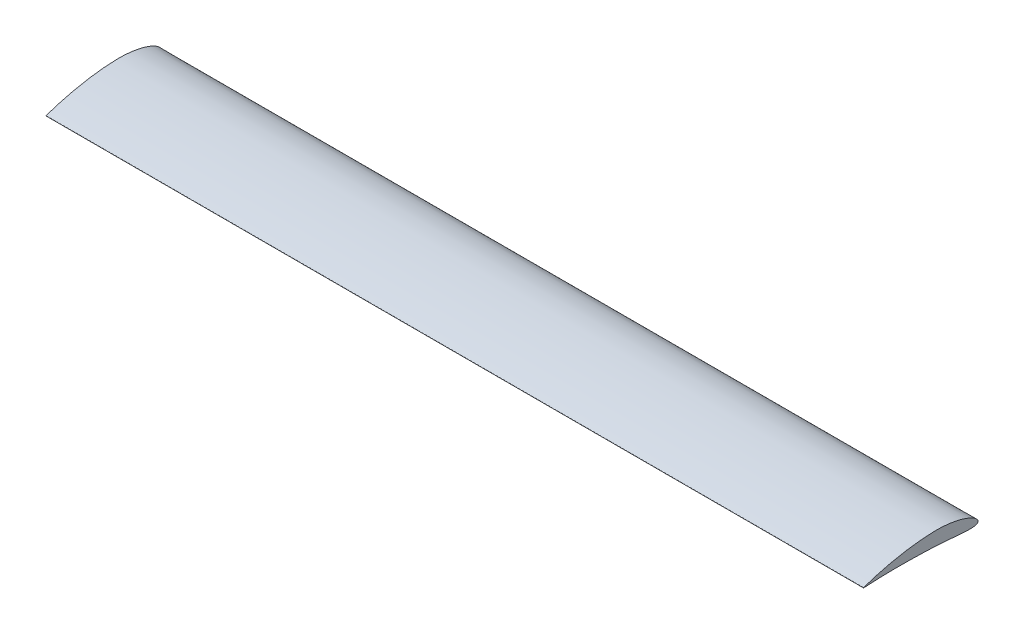
ISO-10303-21;
HEADER;
FILE_DESCRIPTION(('STEP AP214'),'2;1');
FILE_NAME('part.step','',(''),(''),'','','');
FILE_SCHEMA(('AUTOMOTIVE_DESIGN { 1 0 10303 214 1 1 1 1 }'));
ENDSEC;
DATA;
#1=APPLICATION_CONTEXT('core data for automotive mechanical design processes');
#2=APPLICATION_PROTOCOL_DEFINITION('international standard','automotive_design',2000,#1);
#3=PRODUCT_CONTEXT('',#1,'mechanical');
#4=PRODUCT('Part','Part','',(#3));
#5=PRODUCT_RELATED_PRODUCT_CATEGORY('part','',(#4));
#6=PRODUCT_DEFINITION_FORMATION('','',#4);
#7=PRODUCT_DEFINITION_CONTEXT('part definition',#1,'design');
#8=PRODUCT_DEFINITION('design','',#6,#7);
#9=PRODUCT_DEFINITION_SHAPE('','',#8);
#10=(LENGTH_UNIT() NAMED_UNIT(*) SI_UNIT(.MILLI.,.METRE.));
#11=(NAMED_UNIT(*) PLANE_ANGLE_UNIT() SI_UNIT($,.RADIAN.));
#12=(NAMED_UNIT(*) SI_UNIT($,.STERADIAN.) SOLID_ANGLE_UNIT());
#13=UNCERTAINTY_MEASURE_WITH_UNIT(LENGTH_MEASURE(1.E-05),#10,'distance_accuracy_value','');
#14=(GEOMETRIC_REPRESENTATION_CONTEXT(3) GLOBAL_UNCERTAINTY_ASSIGNED_CONTEXT((#13)) GLOBAL_UNIT_ASSIGNED_CONTEXT((#10,
#11,#12)) REPRESENTATION_CONTEXT('',''));
#15=CARTESIAN_POINT('',(0.,0.,0.));
#16=DIRECTION('',(0.,0.,1.));
#17=DIRECTION('',(1.,0.,0.));
#18=AXIS2_PLACEMENT_3D('',#15,#16,#17);
#19=CARTESIAN_POINT('',(-1270.,-0.0302571964763549,354.787327227915));
#20=CARTESIAN_POINT('',(-1270.,-0.202511549774369,354.777220058735));
#21=CARTESIAN_POINT('',(-1270.,-0.758116619532224,354.744619463571));
#22=CARTESIAN_POINT('',(-1270.,-0.0353878265544988,352.780150329408));
#23=CARTESIAN_POINT('',(-1270.,-0.406394891328532,350.227621537646));
#24=CARTESIAN_POINT('',(-1270.,0.191518705423128,345.076973542852));
#25=CARTESIAN_POINT('',(-1270.,0.426846954997304,338.388880463138));
#26=CARTESIAN_POINT('',(-1270.,0.912902226587254,329.767358245601));
#27=CARTESIAN_POINT('',(-1270.,1.37107480853054,319.513378005819));
#28=CARTESIAN_POINT('',(-1270.,1.85212662662604,307.681856469284));
#29=CARTESIAN_POINT('',(-1270.,2.2828903737653,294.437996631764));
#30=CARTESIAN_POINT('',(-1270.,2.65636592644588,279.933149694368));
#31=CARTESIAN_POINT('',(-1270.,2.90744759821903,264.337268620967));
#32=CARTESIAN_POINT('',(-1270.,3.02848065946825,247.830237404837));
#33=CARTESIAN_POINT('',(-1270.,2.97910623211237,224.541124113717));
#34=CARTESIAN_POINT('',(-1270.,2.58624656268472,200.671973719441));
#35=CARTESIAN_POINT('',(-1270.,1.91789319340299,176.483884619505));
#36=CARTESIAN_POINT('',(-1270.,1.28674404323604,158.296467958687));
#37=CARTESIAN_POINT('',(-1270.,0.674535202653767,140.48477689744));
#38=CARTESIAN_POINT('',(-1270.,-0.458414507964394,117.937239158073));
#39=CARTESIAN_POINT('',(-1270.,-2.15355585803942,96.4067365521407));
#40=CARTESIAN_POINT('',(-1270.,-3.98391169785236,75.9298626432168));
#41=CARTESIAN_POINT('',(-1270.,-5.23803481691952,61.9523939500743));
#42=CARTESIAN_POINT('',(-1270.,-6.3018667845873,49.0830780174977));
#43=CARTESIAN_POINT('',(-1270.,-7.05379709208437,37.4470572233417));
#44=CARTESIAN_POINT('',(-1270.,-7.40487495085787,27.1638266260831));
#45=CARTESIAN_POINT('',(-1270.,-7.26852765592077,18.3491197902741));
#46=CARTESIAN_POINT('',(-1270.,-6.58746462442697,11.0873159681167));
#47=CARTESIAN_POINT('',(-1270.,-5.28808573883758,5.4507808849597));
#48=CARTESIAN_POINT('',(-1270.,-3.30894318563573,1.35108725963543));
#49=CARTESIAN_POINT('',(-1270.,-0.148325215865237,-0.987487677240321));
#50=CARTESIAN_POINT('',(-1270.,3.7967578133831,-0.765838064798878));
#51=CARTESIAN_POINT('',(-1270.,7.71649979382027,1.67922407257184));
#52=CARTESIAN_POINT('',(-1270.,11.8553419578337,5.92689766090299));
#53=CARTESIAN_POINT('',(-1270.,16.2262899348965,12.1072031542234));
#54=CARTESIAN_POINT('',(-1270.,20.7343193498453,20.187014187513));
#55=CARTESIAN_POINT('',(-1270.,25.2201252971746,30.130463623116));
#56=CARTESIAN_POINT('',(-1270.,29.5108543834638,41.8433907768923));
#57=CARTESIAN_POINT('',(-1270.,33.4329059974258,55.1997604360673));
#58=CARTESIAN_POINT('',(-1270.,36.8104805743368,70.0434509571498));
#59=CARTESIAN_POINT('',(-1270.,39.4786761807971,86.1884085277303));
#60=CARTESIAN_POINT('',(-1270.,41.32105063238,103.42216726238));
#61=CARTESIAN_POINT('',(-1270.,42.2288581946823,121.516747473044));
#62=CARTESIAN_POINT('',(-1270.,42.1113766684293,140.09669102153));
#63=CARTESIAN_POINT('',(-1270.,41.1132128906756,158.902335219002));
#64=CARTESIAN_POINT('',(-1270.,39.0904540579609,183.961657870227));
#65=CARTESIAN_POINT('',(-1270.,36.0047557168601,208.774809212926));
#66=CARTESIAN_POINT('',(-1270.,31.1455287976255,238.622276389231));
#67=CARTESIAN_POINT('',(-1270.,26.6515697314507,261.175777938493));
#68=CARTESIAN_POINT('',(-1270.,21.7242725259394,282.422876263721));
#69=CARTESIAN_POINT('',(-1270.,17.1306006385399,300.598349456261));
#70=CARTESIAN_POINT('',(-1270.,11.7988919274353,319.654473711953));
#71=CARTESIAN_POINT('',(-1270.,6.72155114802005,336.024074691811));
#72=CARTESIAN_POINT('',(-1270.,3.49779827393597,345.800950265157));
#73=CARTESIAN_POINT('',(-1270.,1.92709586834348,350.478726649503));
#74=CARTESIAN_POINT('',(-1270.,0.953557869568799,353.29965963041));
#75=CARTESIAN_POINT('',(-1270.,0.519388000117919,354.559877308969));
#76=CARTESIAN_POINT('',(-1270.,0.410417886541196,354.876173010782));
#77=B_SPLINE_CURVE_WITH_KNOTS('',3,(#19,#20,#21,#22,#23,#24,#25,#26,#27,#28,#29,#30,#31,#32,#33,
#34,#35,#36,#37,#38,#39,#40,#41,#42,#43,#44,#45,#46,#47,#48,#49,#50,#51,#52,#53,#54,#55,#56,#57,
#58,#59,#60,#61,#62,#63,#64,#65,#66,#67,#68,#69,#70,#71,#72,#73,#74,#75,#76),.UNSPECIFIED.,.F.,
.F.,(4,1,1,1,1,1,1,1,1,1,1,1,1,1,1,1,1,1,1,1,1,1,1,1,1,1,1,1,1,1,1,1,1,1,1,1,1,1,1,1,1,1,1,1,1,
1,1,1,1,1,1,1,1,1,1,4),(0.,0.00061435602735338,0.00198160056276364,0.00606849911990259,
0.0128259983002053,0.0221600600259541,0.0339528411484215,0.0480573219049674,0.0643016527838605,
0.0824806064748046,0.102390013464696,0.123786894847983,0.146429707819126,0.170067604158041,
0.219268231220122,0.244299756437978,0.269272617042279,0.293879334559277,0.317367886846568,
0.361825599196296,0.382415541627446,0.401655123624231,0.419361860817184,0.435356743556399,
0.44945739068769,0.461534248286615,0.471483960270294,0.479298491667603,0.485175806315722,
0.489815015537041,0.49445371882196,0.500384211459872,0.508369297965653,0.518670584727767,
0.531320006060474,0.54625561026072,0.563345994084458,0.58242326585592,0.60328874622392,
0.625720296766354,0.649474912467889,0.674310012117921,0.699958821683972,0.725614899189679,
0.751503233324799,0.803021620411888,0.828087427427487,0.875472920842336,0.897280851310736,
0.917503738861992,0.952328750245583,0.978398030734231,0.987765198149775,0.994535224157492,
0.998628423374974,1.),.UNSPECIFIED.);
#78=DIRECTION('',(1.,0.,0.));
#79=VECTOR('',#78,1.);
#80=SURFACE_OF_LINEAR_EXTRUSION('',#77,#79);
#81=DIRECTION('',(1.,0.,0.));
#82=VECTOR('',#81,1.);
#83=CARTESIAN_POINT('',(-1270.,0.410417886541196,354.876173010782));
#84=LINE('',#83,#82);
#85=CARTESIAN_POINT('',(-1270.,0.410417886541196,354.876173010782));
#86=VERTEX_POINT('',#85);
#87=CARTESIAN_POINT('',(1270.,0.410417886541196,354.876173010782));
#88=VERTEX_POINT('',#87);
#89=EDGE_CURVE('E45',#86,#88,#84,.T.);
#90=ORIENTED_EDGE('',*,*,#89,.T.);
#91=CARTESIAN_POINT('',(1270.,-0.0302571964763549,354.787327227915));
#92=CARTESIAN_POINT('',(1270.,-0.202511549774369,354.777220058735));
#93=CARTESIAN_POINT('',(1270.,-0.758116619532224,354.744619463571));
#94=CARTESIAN_POINT('',(1270.,-0.0353878265544988,352.780150329408));
#95=CARTESIAN_POINT('',(1270.,-0.406394891328532,350.227621537646));
#96=CARTESIAN_POINT('',(1270.,0.191518705423128,345.076973542852));
#97=CARTESIAN_POINT('',(1270.,0.426846954997304,338.388880463138));
#98=CARTESIAN_POINT('',(1270.,0.912902226587254,329.767358245601));
#99=CARTESIAN_POINT('',(1270.,1.37107480853054,319.513378005819));
#100=CARTESIAN_POINT('',(1270.,1.85212662662604,307.681856469284));
#101=CARTESIAN_POINT('',(1270.,2.2828903737653,294.437996631764));
#102=CARTESIAN_POINT('',(1270.,2.65636592644588,279.933149694368));
#103=CARTESIAN_POINT('',(1270.,2.90744759821903,264.337268620967));
#104=CARTESIAN_POINT('',(1270.,3.02848065946825,247.830237404837));
#105=CARTESIAN_POINT('',(1270.,2.97910623211237,224.541124113717));
#106=CARTESIAN_POINT('',(1270.,2.58624656268472,200.671973719441));
#107=CARTESIAN_POINT('',(1270.,1.91789319340299,176.483884619505));
#108=CARTESIAN_POINT('',(1270.,1.28674404323604,158.296467958687));
#109=CARTESIAN_POINT('',(1270.,0.674535202653767,140.48477689744));
#110=CARTESIAN_POINT('',(1270.,-0.458414507964394,117.937239158073));
#111=CARTESIAN_POINT('',(1270.,-2.15355585803942,96.4067365521407));
#112=CARTESIAN_POINT('',(1270.,-3.98391169785236,75.9298626432168));
#113=CARTESIAN_POINT('',(1270.,-5.23803481691952,61.9523939500743));
#114=CARTESIAN_POINT('',(1270.,-6.3018667845873,49.0830780174977));
#115=CARTESIAN_POINT('',(1270.,-7.05379709208437,37.4470572233417));
#116=CARTESIAN_POINT('',(1270.,-7.40487495085787,27.1638266260831));
#117=CARTESIAN_POINT('',(1270.,-7.26852765592077,18.3491197902741));
#118=CARTESIAN_POINT('',(1270.,-6.58746462442697,11.0873159681167));
#119=CARTESIAN_POINT('',(1270.,-5.28808573883758,5.4507808849597));
#120=CARTESIAN_POINT('',(1270.,-3.30894318563573,1.35108725963543));
#121=CARTESIAN_POINT('',(1270.,-0.148325215865237,-0.987487677240321));
#122=CARTESIAN_POINT('',(1270.,3.7967578133831,-0.765838064798878));
#123=CARTESIAN_POINT('',(1270.,7.71649979382027,1.67922407257184));
#124=CARTESIAN_POINT('',(1270.,11.8553419578337,5.92689766090299));
#125=CARTESIAN_POINT('',(1270.,16.2262899348965,12.1072031542234));
#126=CARTESIAN_POINT('',(1270.,20.7343193498453,20.187014187513));
#127=CARTESIAN_POINT('',(1270.,25.2201252971746,30.130463623116));
#128=CARTESIAN_POINT('',(1270.,29.5108543834638,41.8433907768923));
#129=CARTESIAN_POINT('',(1270.,33.4329059974258,55.1997604360673));
#130=CARTESIAN_POINT('',(1270.,36.8104805743368,70.0434509571498));
#131=CARTESIAN_POINT('',(1270.,39.4786761807971,86.1884085277303));
#132=CARTESIAN_POINT('',(1270.,41.32105063238,103.42216726238));
#133=CARTESIAN_POINT('',(1270.,42.2288581946823,121.516747473044));
#134=CARTESIAN_POINT('',(1270.,42.1113766684293,140.09669102153));
#135=CARTESIAN_POINT('',(1270.,41.1132128906756,158.902335219002));
#136=CARTESIAN_POINT('',(1270.,39.0904540579609,183.961657870227));
#137=CARTESIAN_POINT('',(1270.,36.0047557168601,208.774809212926));
#138=CARTESIAN_POINT('',(1270.,31.1455287976255,238.622276389231));
#139=CARTESIAN_POINT('',(1270.,26.6515697314507,261.175777938493));
#140=CARTESIAN_POINT('',(1270.,21.7242725259394,282.422876263721));
#141=CARTESIAN_POINT('',(1270.,17.1306006385399,300.598349456261));
#142=CARTESIAN_POINT('',(1270.,11.7988919274353,319.654473711953));
#143=CARTESIAN_POINT('',(1270.,6.72155114802005,336.024074691811));
#144=CARTESIAN_POINT('',(1270.,3.49779827393597,345.800950265157));
#145=CARTESIAN_POINT('',(1270.,1.92709586834348,350.478726649503));
#146=CARTESIAN_POINT('',(1270.,0.953557869568799,353.29965963041));
#147=CARTESIAN_POINT('',(1270.,0.519388000117919,354.559877308969));
#148=CARTESIAN_POINT('',(1270.,0.410417886541196,354.876173010782));
#149=B_SPLINE_CURVE_WITH_KNOTS('',3,(#91,#92,#93,#94,#95,#96,#97,#98,#99,#100,#101,#102,#103,
#104,#105,#106,#107,#108,#109,#110,#111,#112,#113,#114,#115,#116,#117,#118,#119,#120,#121,#122,
#123,#124,#125,#126,#127,#128,#129,#130,#131,#132,#133,#134,#135,#136,#137,#138,#139,#140,#141,
#142,#143,#144,#145,#146,#147,#148),.UNSPECIFIED.,.F.,.F.,(4,1,1,1,1,1,1,1,1,1,1,1,1,1,1,1,1,1,
1,1,1,1,1,1,1,1,1,1,1,1,1,1,1,1,1,1,1,1,1,1,1,1,1,1,1,1,1,1,1,1,1,1,1,1,1,4),(0.,
0.00061435602735338,0.00198160056276364,0.00606849911990259,0.0128259983002053,
0.0221600600259541,0.0339528411484215,0.0480573219049674,0.0643016527838605,0.0824806064748046,
0.102390013464696,0.123786894847983,0.146429707819126,0.170067604158041,0.219268231220122,
0.244299756437978,0.269272617042279,0.293879334559277,0.317367886846568,0.361825599196296,
0.382415541627446,0.401655123624231,0.419361860817184,0.435356743556399,0.44945739068769,
0.461534248286615,0.471483960270294,0.479298491667603,0.485175806315722,0.489815015537041,
0.49445371882196,0.500384211459872,0.508369297965653,0.518670584727767,0.531320006060474,
0.54625561026072,0.563345994084458,0.58242326585592,0.60328874622392,0.625720296766354,
0.649474912467889,0.674310012117921,0.699958821683972,0.725614899189679,0.751503233324799,
0.803021620411888,0.828087427427487,0.875472920842336,0.897280851310736,0.917503738861992,
0.952328750245583,0.978398030734231,0.987765198149775,0.994535224157492,0.998628423374974,1.),.UNSPECIFIED.);
#150=CARTESIAN_POINT('',(1270.,-0.030257196476355,354.787327227915));
#151=VERTEX_POINT('',#150);
#152=EDGE_CURVE('E67',#151,#88,#149,.T.);
#153=ORIENTED_EDGE('',*,*,#152,.F.);
#154=DIRECTION('',(1.,0.,0.));
#155=VECTOR('',#154,1.);
#156=CARTESIAN_POINT('',(-1270.,-0.030257196476355,354.787327227915));
#157=LINE('',#156,#155);
#158=CARTESIAN_POINT('',(-1270.,-0.030257196476355,354.787327227915));
#159=VERTEX_POINT('',#158);
#160=EDGE_CURVE('E11',#159,#151,#157,.T.);
#161=ORIENTED_EDGE('',*,*,#160,.F.);
#162=EDGE_CURVE('E68',#159,#86,#77,.T.);
#163=ORIENTED_EDGE('',*,*,#162,.T.);
#164=EDGE_LOOP('',(#90,#153,#161,#163));
#165=FACE_BOUND('',#164,.T.);
#166=ADVANCED_FACE('F41',(#165),#80,.T.);
#167=CARTESIAN_POINT('',(-1270.,-0.030257196476355,354.787327227915));
#168=DIRECTION('',(0.,-0.197636177726589,0.980275441523261));
#169=DIRECTION('',(0.,-0.980275441523261,-0.197636177726589));
#170=AXIS2_PLACEMENT_3D('',#167,#168,#169);
#171=PLANE('',#170);
#172=ORIENTED_EDGE('',*,*,#160,.T.);
#173=DIRECTION('',(0.,-0.980275441523261,-0.197636177726589));
#174=VECTOR('',#173,1.);
#175=CARTESIAN_POINT('',(1270.,-0.030257196476355,354.787327227915));
#176=LINE('',#175,#174);
#177=EDGE_CURVE('E73',#88,#151,#176,.T.);
#178=ORIENTED_EDGE('',*,*,#177,.F.);
#179=ORIENTED_EDGE('',*,*,#89,.F.);
#180=DIRECTION('',(0.,-0.980275441523261,-0.197636177726589));
#181=VECTOR('',#180,1.);
#182=CARTESIAN_POINT('',(-1270.,-0.030257196476355,354.787327227915));
#183=LINE('',#182,#181);
#184=EDGE_CURVE('E71',#86,#159,#183,.T.);
#185=ORIENTED_EDGE('',*,*,#184,.T.);
#186=EDGE_LOOP('',(#172,#178,#179,#185));
#187=FACE_BOUND('',#186,.T.);
#188=ADVANCED_FACE('F74',(#187),#171,.T.);
#189=CARTESIAN_POINT('',(-1270.,6.95548452892668,1.34686834904547));
#190=DIRECTION('',(-1.,0.,0.));
#191=DIRECTION('',(0.,0.,1.));
#192=AXIS2_PLACEMENT_3D('',#189,#190,#191);
#193=PLANE('',#192);
#194=ORIENTED_EDGE('',*,*,#162,.F.);
#195=ORIENTED_EDGE('',*,*,#184,.F.);
#196=EDGE_LOOP('',(#194,#195));
#197=FACE_BOUND('',#196,.T.);
#198=ADVANCED_FACE('F96',(#197),#193,.T.);
#199=CARTESIAN_POINT('',(1270.,6.95548452892668,1.34686834904547));
#200=DIRECTION('',(-1.,0.,0.));
#201=DIRECTION('',(0.,0.,1.));
#202=AXIS2_PLACEMENT_3D('',#199,#200,#201);
#203=PLANE('',#202);
#204=ORIENTED_EDGE('',*,*,#152,.T.);
#205=ORIENTED_EDGE('',*,*,#177,.T.);
#206=EDGE_LOOP('',(#204,#205));
#207=FACE_BOUND('',#206,.T.);
#208=ADVANCED_FACE('F78',(#207),#203,.F.);
#209=CLOSED_SHELL('',(#166,#188,#198,#208));
#210=MANIFOLD_SOLID_BREP('B2',#209);
#211=ADVANCED_BREP_SHAPE_REPRESENTATION('',(#18,#210),#14);
#212=SHAPE_DEFINITION_REPRESENTATION(#9,#211);
ENDSEC;
END-ISO-10303-21;
